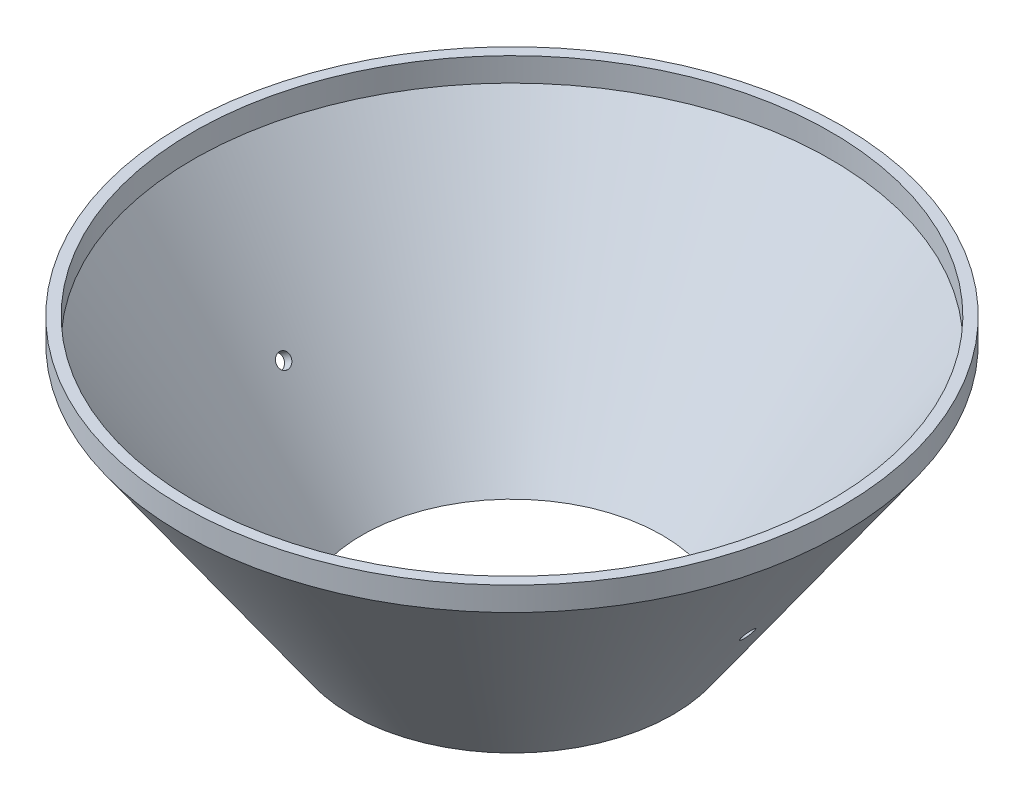
ISO-10303-21;
HEADER;
FILE_DESCRIPTION(('STEP AP214'),'2;1');
FILE_NAME('part.step','',(''),(''),'','','');
FILE_SCHEMA(('AUTOMOTIVE_DESIGN { 1 0 10303 214 1 1 1 1 }'));
ENDSEC;
DATA;
#1=APPLICATION_CONTEXT('core data for automotive mechanical design processes');
#2=APPLICATION_PROTOCOL_DEFINITION('international standard','automotive_design',2000,#1);
#3=PRODUCT_CONTEXT('',#1,'mechanical');
#4=PRODUCT('Part','Part','',(#3));
#5=PRODUCT_RELATED_PRODUCT_CATEGORY('part','',(#4));
#6=PRODUCT_DEFINITION_FORMATION('','',#4);
#7=PRODUCT_DEFINITION_CONTEXT('part definition',#1,'design');
#8=PRODUCT_DEFINITION('design','',#6,#7);
#9=PRODUCT_DEFINITION_SHAPE('','',#8);
#10=(LENGTH_UNIT() NAMED_UNIT(*) SI_UNIT(.MILLI.,.METRE.));
#11=(NAMED_UNIT(*) PLANE_ANGLE_UNIT() SI_UNIT($,.RADIAN.));
#12=(NAMED_UNIT(*) SI_UNIT($,.STERADIAN.) SOLID_ANGLE_UNIT());
#13=UNCERTAINTY_MEASURE_WITH_UNIT(LENGTH_MEASURE(1.E-05),#10,'distance_accuracy_value','');
#14=(GEOMETRIC_REPRESENTATION_CONTEXT(3) GLOBAL_UNCERTAINTY_ASSIGNED_CONTEXT((#13)) GLOBAL_UNIT_ASSIGNED_CONTEXT((#10,
#11,#12)) REPRESENTATION_CONTEXT('',''));
#15=CARTESIAN_POINT('',(0.,0.,0.));
#16=DIRECTION('',(0.,0.,1.));
#17=DIRECTION('',(1.,0.,0.));
#18=AXIS2_PLACEMENT_3D('',#15,#16,#17);
#19=CARTESIAN_POINT('',(0.,0.,0.));
#20=DIRECTION('',(0.,1.,0.));
#21=DIRECTION('',(0.,0.,1.));
#22=AXIS2_PLACEMENT_3D('',#19,#20,#21);
#23=CONICAL_SURFACE('',#22,12.63,0.610865238198013);
#24=CARTESIAN_POINT('',(18.9409920304637,9.0174198213227,-0.341221752310358));
#25=CARTESIAN_POINT('',(18.9516528807942,9.03335579514401,-0.368943909328451));
#26=CARTESIAN_POINT('',(18.9636435000784,9.05123552282013,-0.395067037450147));
#27=CARTESIAN_POINT('',(18.9899743840398,9.09035338379973,-0.443349914106763));
#28=CARTESIAN_POINT('',(19.0043174497796,9.1115955196641,-0.465504871129191));
#29=CARTESIAN_POINT('',(19.0349633828263,9.15679390072063,-0.50518849983412));
#30=CARTESIAN_POINT('',(19.0512653268974,9.18074886702915,-0.522719338550814));
#31=CARTESIAN_POINT('',(19.0853931640646,9.23067439551349,-0.552662840553579));
#32=CARTESIAN_POINT('',(19.1032186768391,9.25664445452257,-0.565076776669665));
#33=CARTESIAN_POINT('',(19.1399109995928,9.30985368090245,-0.584440567537122));
#34=CARTESIAN_POINT('',(19.1587777706456,9.33709280082461,-0.591390626402794));
#35=CARTESIAN_POINT('',(19.1970293725544,9.3920606076407,-0.599629592854147));
#36=CARTESIAN_POINT('',(19.2164142227705,9.41978931281672,-0.60091828858248));
#37=CARTESIAN_POINT('',(19.2551462793119,9.47493881765334,-0.597797819956837));
#38=CARTESIAN_POINT('',(19.2744934948745,9.50235970373208,-0.593390297285299));
#39=CARTESIAN_POINT('',(19.3125978896348,9.55612948038676,-0.579005599975749));
#40=CARTESIAN_POINT('',(19.3313550697851,9.58247837269348,-0.569028434330533));
#41=CARTESIAN_POINT('',(19.3677306271828,9.63337050382939,-0.543787270498571));
#42=CARTESIAN_POINT('',(19.3853489389023,9.65791363877063,-0.528522968422767));
#43=CARTESIAN_POINT('',(19.418921477716,9.70451373168668,-0.493141031359007));
#44=CARTESIAN_POINT('',(19.4348757045594,9.72657068928651,-0.473023395639034));
#45=CARTESIAN_POINT('',(19.4646436210162,9.76759906631191,-0.428498929059879));
#46=CARTESIAN_POINT('',(19.478456690162,9.78656959142532,-0.404090859268899));
#47=CARTESIAN_POINT('',(19.5035154908795,9.82089977862868,-0.351681822803491));
#48=CARTESIAN_POINT('',(19.5147612184523,9.83625943509415,-0.32368085053267));
#49=CARTESIAN_POINT('',(19.5343397661102,9.86295178733934,-0.264878076519693));
#50=CARTESIAN_POINT('',(19.542672364744,9.87428417697387,-0.234076062071062));
#51=CARTESIAN_POINT('',(19.5561648101363,9.89261354016701,-0.170547348437313));
#52=CARTESIAN_POINT('',(19.5613246634901,9.89961052273778,-0.137820653253258));
#53=CARTESIAN_POINT('',(19.5683097414493,9.90907886567705,-0.0713802071735972));
#54=CARTESIAN_POINT('',(19.5701357893078,9.9115513433315,-0.0376667020516754));
#55=CARTESIAN_POINT('',(19.5703986409376,9.91190736541768,0.0297977072534092));
#56=CARTESIAN_POINT('',(19.5688354486134,9.90979091513603,0.063548611393442));
#57=CARTESIAN_POINT('',(19.5623693554034,9.90102703926073,0.130123075161604));
#58=CARTESIAN_POINT('',(19.5574670852682,9.89438046940476,0.162946808712521));
#59=CARTESIAN_POINT('',(19.5444764066079,9.87673666923223,0.226742209433612));
#60=CARTESIAN_POINT('',(19.5363879948134,9.86573943445126,0.257713874703265));
#61=CARTESIAN_POINT('',(19.5172744794256,9.83968964124902,0.316931433895236));
#62=CARTESIAN_POINT('',(19.5062489125108,9.82463644301547,0.345176896814268));
#63=CARTESIAN_POINT('',(19.4816012673562,9.79088395687603,0.398135619957056));
#64=CARTESIAN_POINT('',(19.4679791843011,9.77218466220844,0.422848873630181));
#65=CARTESIAN_POINT('',(19.4385502170128,9.7316443887814,0.468048391004436));
#66=CARTESIAN_POINT('',(19.4227427576482,9.70980258293727,0.488533538434191));
#67=CARTESIAN_POINT('',(19.3894229293304,9.66358050446548,0.524687191991051));
#68=CARTESIAN_POINT('',(19.3719105610265,9.63920023280481,0.540355699952949));
#69=CARTESIAN_POINT('',(19.3357034543183,9.58857652416261,0.566430488966751));
#70=CARTESIAN_POINT('',(19.3170087596837,9.56233315614848,0.576836964690846));
#71=CARTESIAN_POINT('',(19.278985518405,9.50871473112502,0.592092607309417));
#72=CARTESIAN_POINT('',(19.2596569727668,9.48133967591143,0.596941783021796));
#73=CARTESIAN_POINT('',(19.2209301853392,9.4262367058419,0.600944259560997));
#74=CARTESIAN_POINT('',(19.2015319651402,9.39850889449173,0.600099194398645));
#75=CARTESIAN_POINT('',(19.1632107021641,9.34348033562615,0.592741075740981));
#76=CARTESIAN_POINT('',(19.1442876585822,9.31617958738738,0.586228031846973));
#77=CARTESIAN_POINT('',(19.1074451751407,9.26279002378877,0.567720083972554));
#78=CARTESIAN_POINT('',(19.0895256394528,9.23670109274913,0.555725704428884));
#79=CARTESIAN_POINT('',(19.0551769514751,9.186485962648,0.526595960401006));
#80=CARTESIAN_POINT('',(19.0387478044656,9.16235977054041,0.509460577703492));
#81=CARTESIAN_POINT('',(19.0078154886344,9.11676697764842,0.470530262506525));
#82=CARTESIAN_POINT('',(18.9933127988557,9.09530103846516,0.448734174554881));
#83=CARTESIAN_POINT('',(18.9666191084016,9.0556656316715,0.401103215934937));
#84=CARTESIAN_POINT('',(18.954428115545,9.03749617521055,0.375268331607078));
#85=CARTESIAN_POINT('',(18.932670497573,9.00498708154816,0.320286275363405));
#86=CARTESIAN_POINT('',(18.9231044593827,8.99064830088309,0.291138364730669));
#87=CARTESIAN_POINT('',(18.9068448344701,8.9662330439194,0.230363159170827));
#88=CARTESIAN_POINT('',(18.9001511322964,8.9561563963075,0.198735963957302));
#89=CARTESIAN_POINT('',(18.8898061164297,8.94056790092257,0.133908223698161));
#90=CARTESIAN_POINT('',(18.8861539701373,8.93505480391981,0.100708111856573));
#91=CARTESIAN_POINT('',(18.8819804712424,8.92875382241924,0.0336597777743027));
#92=CARTESIAN_POINT('',(18.8814598860175,8.92796709610127,-0.000188601283556134));
#93=CARTESIAN_POINT('',(18.8835636636255,8.93114416410418,-0.0675665199245233));
#94=CARTESIAN_POINT('',(18.8861886374448,8.93510888133485,-0.101095996289468));
#95=CARTESIAN_POINT('',(18.8945180001919,8.94767030676081,-0.166851548132624));
#96=CARTESIAN_POINT('',(18.9002187055197,8.95626147413967,-0.199079133274329));
#97=CARTESIAN_POINT('',(18.9118670403593,8.97377563061058,-0.249700905151459));
#98=CARTESIAN_POINT('',(18.9169294507424,8.98137959517991,-0.268771196420281));
#99=CARTESIAN_POINT('',(18.9281511365663,8.9982078066753,-0.305844279334318));
#100=CARTESIAN_POINT('',(18.9343104119751,9.00743205355399,-0.323847071010733));
#101=CARTESIAN_POINT('',(18.9409920304637,9.0174198213227,-0.341221752310358));
#102=B_SPLINE_CURVE_WITH_KNOTS('',3,(#24,#25,#26,#27,#28,#29,#30,#31,#32,#33,#34,#35,#36,#37,
#38,#39,#40,#41,#42,#43,#44,#45,#46,#47,#48,#49,#50,#51,#52,#53,#54,#55,#56,#57,#58,#59,#60,#61,
#62,#63,#64,#65,#66,#67,#68,#69,#70,#71,#72,#73,#74,#75,#76,#77,#78,#79,#80,#81,#82,#83,#84,#85,
#86,#87,#88,#89,#90,#91,#92,#93,#94,#95,#96,#97,#98,#99,#100,#101),.UNSPECIFIED.,.T.,.F.,(4,2,2,
2,2,2,2,2,2,2,2,2,2,2,2,2,2,2,2,2,2,2,2,2,2,2,2,2,2,2,2,2,2,2,2,2,2,2,4),(0.,0.10104235923319,
0.202205915079846,0.30332197734218,0.404412871772923,0.505499989567225,0.606590890172453,
0.707652662303131,0.808714271259004,0.909781689903226,1.01084912379122,1.11194579061356,
1.21304261490842,1.31414712274878,1.41525142041871,1.51633074791722,1.61740995896861,
1.71847008148962,1.81953030771289,1.9206064851317,2.0216828499981,2.12278586621353,
2.22388884391596,2.32498808097645,2.42608715762013,2.52715722426009,2.62822711969221,
2.72928734710247,2.83034793254846,2.93143360139531,3.03251961213003,3.13362820674223,
3.23473273698328,3.33580958163437,3.43691119378623,3.53803244687288,3.63903286168514,
3.70236050388859,3.76568814424115),.UNSPECIFIED.);
#103=CARTESIAN_POINT('',(18.9409920304637,9.0174198213227,-0.341221752310358));
#104=VERTEX_POINT('',#103);
#105=EDGE_CURVE('E58',#104,#104,#102,.T.);
#106=ORIENTED_EDGE('',*,*,#105,.T.);
#107=EDGE_LOOP('',(#106));
#108=FACE_BOUND('',#107,.T.);
#109=CARTESIAN_POINT('',(0.,20.2860127652251,0.));
#110=DIRECTION('',(0.,1.,0.));
#111=DIRECTION('',(0.,0.,1.));
#112=AXIS2_PLACEMENT_3D('',#109,#110,#111);
#113=CIRCLE('',#112,26.8344190584289);
#114=CARTESIAN_POINT('',(0.,20.2860127652251,26.8344190584289));
#115=VERTEX_POINT('',#114);
#116=EDGE_CURVE('E99',#115,#115,#113,.T.);
#117=ORIENTED_EDGE('',*,*,#116,.T.);
#118=EDGE_LOOP('',(#117));
#119=FACE_BOUND('',#118,.T.);
#120=CARTESIAN_POINT('',(0.,0.,0.));
#121=DIRECTION('',(0.,1.,0.));
#122=DIRECTION('',(0.,0.,1.));
#123=AXIS2_PLACEMENT_3D('',#120,#121,#122);
#124=CIRCLE('',#123,12.63);
#125=CARTESIAN_POINT('',(0.,0.,12.63));
#126=VERTEX_POINT('',#125);
#127=EDGE_CURVE('E10',#126,#126,#124,.T.);
#128=ORIENTED_EDGE('',*,*,#127,.F.);
#129=EDGE_LOOP('',(#128));
#130=FACE_BOUND('',#129,.T.);
#131=CARTESIAN_POINT('',(-19.4175885176778,9.70263879091386,-0.493584225455071));
#132=CARTESIAN_POINT('',(-19.401358281771,9.68016229249147,-0.512741554706572));
#133=CARTESIAN_POINT('',(-19.3842083219253,9.6563303550641,-0.529572307843522));
#134=CARTESIAN_POINT('',(-19.3485868387306,9.60662035558906,-0.55808031479809));
#135=CARTESIAN_POINT('',(-19.3301137610521,9.58073988315153,-0.569751387967736));
#136=CARTESIAN_POINT('',(-19.2924106182585,9.52768117822798,-0.587585099760743));
#137=CARTESIAN_POINT('',(-19.2731809071034,9.50050355132441,-0.593750282841554));
#138=CARTESIAN_POINT('',(-19.2345210675658,9.44561254210044,-0.600402352030291));
#139=CARTESIAN_POINT('',(-19.2150909900072,9.41789929415578,-0.600890644290871));
#140=CARTESIAN_POINT('',(-19.1765805091088,9.36271767045297,-0.59617963148716));
#141=CARTESIAN_POINT('',(-19.1575000758947,9.33524927387818,-0.590980814666785));
#142=CARTESIAN_POINT('',(-19.1202199661323,9.28133946924398,-0.575043678832523));
#143=CARTESIAN_POINT('',(-19.1020203243432,9.25489810172281,-0.564305141396736));
#144=CARTESIAN_POINT('',(-19.0670007646207,9.20380503618891,-0.53759319556737));
#145=CARTESIAN_POINT('',(-19.0501808948431,9.17915340064377,-0.521619604560236));
#146=CARTESIAN_POINT('',(-19.0183735379543,9.1323573899341,-0.484891136578407));
#147=CARTESIAN_POINT('',(-19.0033860509059,9.11021301485563,-0.464136259439591));
#148=CARTESIAN_POINT('',(-18.9756344886406,9.06907390168621,-0.418427061129777));
#149=CARTESIAN_POINT('',(-18.9628710739623,9.05008009938014,-0.393471496686934));
#150=CARTESIAN_POINT('',(-18.939904237595,9.01581068222031,-0.340073127500662));
#151=CARTESIAN_POINT('',(-18.9297008124928,9.00053506240915,-0.311630327406792));
#152=CARTESIAN_POINT('',(-18.9121143372266,8.97415475073056,-0.252062134454913));
#153=CARTESIAN_POINT('',(-18.9047314879638,8.963050355968,-0.220936550703683));
#154=CARTESIAN_POINT('',(-18.892974144582,8.94534574379358,-0.156888039060699));
#155=CARTESIAN_POINT('',(-18.8885996478745,8.93874552250618,-0.123965112715469));
#156=CARTESIAN_POINT('',(-18.8829697752905,8.93024833907432,-0.0572661068152133));
#157=CARTESIAN_POINT('',(-18.88171355048,8.92835009683969,-0.0234902619930983));
#158=CARTESIAN_POINT('',(-18.8823492238672,8.92931015662237,0.0439640183005133));
#159=CARTESIAN_POINT('',(-18.884241116928,8.93216845087811,0.0776424539308693));
#160=CARTESIAN_POINT('',(-18.8911249580144,8.94255477241331,0.143939432796073));
#161=CARTESIAN_POINT('',(-18.8961163315958,8.95008193438496,0.176558171251997));
#162=CARTESIAN_POINT('',(-18.9090730812844,8.96957984270635,0.239816878822741));
#163=CARTESIAN_POINT('',(-18.9170384619207,8.9815505958233,0.270456844923983));
#164=CARTESIAN_POINT('',(-18.9357432063248,9.00958157393836,0.328894924715397));
#165=CARTESIAN_POINT('',(-18.9464831155053,9.02564260298794,0.356692478147025));
#166=CARTESIAN_POINT('',(-18.970460820221,9.06137671622384,0.408650710275896));
#167=CARTESIAN_POINT('',(-18.9836986200892,9.08104980667594,0.432811382664182));
#168=CARTESIAN_POINT('',(-19.0123315442464,9.12343413798412,0.476816578324764));
#169=CARTESIAN_POINT('',(-19.0277272398111,9.14614618329266,0.496659955085492));
#170=CARTESIAN_POINT('',(-19.0602655580122,9.19393973603781,0.531459066221769));
#171=CARTESIAN_POINT('',(-19.0774081796317,9.2190212420951,0.546414803442521));
#172=CARTESIAN_POINT('',(-19.1129760667955,9.27082307710547,0.571012621441633));
#173=CARTESIAN_POINT('',(-19.1314012238735,9.29754326744928,0.58065515095438));
#174=CARTESIAN_POINT('',(-19.1690280768323,9.35185460362496,0.594354225016951));
#175=CARTESIAN_POINT('',(-19.1882297710721,9.37944574761611,0.598410781371617));
#176=CARTESIAN_POINT('',(-19.2268647405924,9.43470279154599,0.600822152710128));
#177=CARTESIAN_POINT('',(-19.2462979461925,9.46236866714561,0.599178642151332));
#178=CARTESIAN_POINT('',(-19.2848457570536,9.517000608428,0.590240368933642));
#179=CARTESIAN_POINT('',(-19.3039603622603,9.54396667399158,0.582945605312338));
#180=CARTESIAN_POINT('',(-19.3413141486674,9.59644210410574,0.562912646850215));
#181=CARTESIAN_POINT('',(-19.3595533642712,9.62195152591124,0.550174666127984));
#182=CARTESIAN_POINT('',(-19.3946183905132,9.67080636420266,0.519617112582942));
#183=CARTESIAN_POINT('',(-19.4114442000467,9.69415177899725,0.501797535788531));
#184=CARTESIAN_POINT('',(-19.4431827994753,9.73804158398756,0.461576916617102));
#185=CARTESIAN_POINT('',(-19.4580950704815,9.75858521452563,0.439174635815026));
#186=CARTESIAN_POINT('',(-19.4855489809308,9.79630193869703,0.390427016085142));
#187=CARTESIAN_POINT('',(-19.4980906135772,9.8134750226669,0.364081665852815));
#188=CARTESIAN_POINT('',(-19.5204205628929,9.84398577067069,0.30819065627958));
#189=CARTESIAN_POINT('',(-19.5302084420283,9.85732282521921,0.278644489404205));
#190=CARTESIAN_POINT('',(-19.5467254797967,9.87979628462473,0.21719369303398));
#191=CARTESIAN_POINT('',(-19.5534546363181,9.88893268658159,0.185289061910858));
#192=CARTESIAN_POINT('',(-19.5636438208904,9.90275656631891,0.120032900465696));
#193=CARTESIAN_POINT('',(-19.5671044128359,9.90744481149837,0.0866816207590281));
#194=CARTESIAN_POINT('',(-19.5706501951097,9.91224837987877,0.0194754291027008));
#195=CARTESIAN_POINT('',(-19.5707355226306,9.9123638889451,-0.0143794623209834));
#196=CARTESIAN_POINT('',(-19.5675291615335,9.90802030192253,-0.0816206311640748));
#197=CARTESIAN_POINT('',(-19.5642386524977,9.90356280373027,-0.115007068139814));
#198=CARTESIAN_POINT('',(-19.5543834728714,9.89019352288147,-0.180384920454299));
#199=CARTESIAN_POINT('',(-19.5478179925184,9.88128063859445,-0.212375988648692));
#200=CARTESIAN_POINT('',(-19.531614290467,9.8592374837752,-0.274060674640525));
#201=CARTESIAN_POINT('',(-19.5219743808316,9.84610489649272,-0.303753019227272));
#202=CARTESIAN_POINT('',(-19.499927230821,9.81598787016023,-0.359954749885985));
#203=CARTESIAN_POINT('',(-19.4875233058232,9.79900804538287,-0.386467891226355));
#204=CARTESIAN_POINT('',(-19.4654082770515,9.76863542846856,-0.426421010043449));
#205=CARTESIAN_POINT('',(-19.4564143963297,9.75626138418274,-0.441052716403137));
#206=CARTESIAN_POINT('',(-19.4375972560163,9.73031576317857,-0.468623118992379));
#207=CARTESIAN_POINT('',(-19.4277739961247,9.716744186027,-0.481561814609453));
#208=CARTESIAN_POINT('',(-19.4175885176778,9.70263879091386,-0.493584225455071));
#209=B_SPLINE_CURVE_WITH_KNOTS('',3,(#131,#132,#133,#134,#135,#136,#137,#138,#139,#140,#141,
#142,#143,#144,#145,#146,#147,#148,#149,#150,#151,#152,#153,#154,#155,#156,#157,#158,#159,#160,
#161,#162,#163,#164,#165,#166,#167,#168,#169,#170,#171,#172,#173,#174,#175,#176,#177,#178,#179,
#180,#181,#182,#183,#184,#185,#186,#187,#188,#189,#190,#191,#192,#193,#194,#195,#196,#197,#198,
#199,#200,#201,#202,#203,#204,#205,#206,#207,#208),.UNSPECIFIED.,.T.,.F.,(4,2,2,2,2,2,2,2,2,2,2,
2,2,2,2,2,2,2,2,2,2,2,2,2,2,2,2,2,2,2,2,2,2,2,2,2,2,2,4),(0.,0.10101959623833,0.202159875524665,
0.303253390254795,0.404321863822778,0.505381661243674,0.606445443587611,0.707512751698957,
0.808580063279501,0.909677340383717,1.01077448269558,1.11187882451312,1.21298307933683,
1.31405980600863,1.41513636774675,1.5161942019858,1.61725219012765,1.7183300592329,
1.81940810367752,1.92051295797901,2.02161775342502,2.12271400861483,2.2238100501575,
2.32487639614162,2.42594275933736,2.52700514727461,2.62806761419895,2.72915742830185,
2.83024753222815,2.9313536889381,3.0324599154519,3.13354869587807,3.23463336740189,
3.3356827300244,3.43675709029216,3.53788703867084,3.63889633062107,3.70229236219332,
3.76568841670026),.UNSPECIFIED.);
#210=CARTESIAN_POINT('',(-19.4175885176778,9.70263879091386,-0.493584225455071));
#211=VERTEX_POINT('',#210);
#212=EDGE_CURVE('E59',#211,#211,#209,.T.);
#213=ORIENTED_EDGE('',*,*,#212,.T.);
#214=EDGE_LOOP('',(#213));
#215=FACE_BOUND('',#214,.T.);
#216=ADVANCED_FACE('F33',(#108,#119,#130,#215),#23,.F.);
#217=CARTESIAN_POINT('',(0.,0.,0.));
#218=DIRECTION('',(0.,1.,0.));
#219=DIRECTION('',(0.,0.,1.));
#220=AXIS2_PLACEMENT_3D('',#217,#218,#219);
#221=CONICAL_SURFACE('',#220,13.5455809415711,0.610865238198013);
#222=CARTESIAN_POINT('',(19.5493810364446,8.57817216272589,-0.324964622568822));
#223=CARTESIAN_POINT('',(19.5595370424983,8.59334700084194,-0.353296683716635));
#224=CARTESIAN_POINT('',(19.5710490332541,8.61050933525755,-0.380107239314218));
#225=CARTESIAN_POINT('',(19.5964876814979,8.64830179497367,-0.42990045901179));
#226=CARTESIAN_POINT('',(19.6104172203701,8.66893605742836,-0.452878490445389));
#227=CARTESIAN_POINT('',(19.6403127454773,8.71304662796792,-0.494319609667414));
#228=CARTESIAN_POINT('',(19.6562777685507,8.73652159160863,-0.512784820880278));
#229=CARTESIAN_POINT('',(19.6898179959309,8.78562848824762,-0.544682028627718));
#230=CARTESIAN_POINT('',(19.707392798613,8.81125988310759,-0.558115276355362));
#231=CARTESIAN_POINT('',(19.74367836113,8.86394287005416,-0.579574288853777));
#232=CARTESIAN_POINT('',(19.7623891129633,8.89099445213697,-0.587600091709051));
#233=CARTESIAN_POINT('',(19.8004287627607,8.94574188579901,-0.598016004667212));
#234=CARTESIAN_POINT('',(19.8197576838398,8.97343776145964,-0.60040590377718));
#235=CARTESIAN_POINT('',(19.8584815554792,9.02867602199109,-0.599481605889067));
#236=CARTESIAN_POINT('',(19.8778764857138,9.05621844824494,-0.596169029715915));
#237=CARTESIAN_POINT('',(19.9161805593865,9.11038051691155,-0.583937123750619));
#238=CARTESIAN_POINT('',(19.9350897037348,9.13700016105354,-0.575017804465641));
#239=CARTESIAN_POINT('',(19.971870427259,9.18857273950986,-0.551825725576345));
#240=CARTESIAN_POINT('',(19.9897419873914,9.21352564323471,-0.537552867750947));
#241=CARTESIAN_POINT('',(20.023917666357,9.26107235903146,-0.504059023206526));
#242=CARTESIAN_POINT('',(20.0402217851719,9.28366617107583,-0.484838036429759));
#243=CARTESIAN_POINT('',(20.0707773677205,9.3258788331042,-0.441987417137616));
#244=CARTESIAN_POINT('',(20.0850282794254,9.34549688309404,-0.418356602893182));
#245=CARTESIAN_POINT('',(20.111039410484,9.38121426960515,-0.367360033828052));
#246=CARTESIAN_POINT('',(20.1227996254785,9.39731359996786,-0.339994272470496));
#247=CARTESIAN_POINT('',(20.1434697285385,9.42555690342294,-0.282301041724159));
#248=CARTESIAN_POINT('',(20.1523793187764,9.43770046322668,-0.251973263301512));
#249=CARTESIAN_POINT('',(20.1670709694438,9.45770049723448,-0.189219200047506));
#250=CARTESIAN_POINT('',(20.1728530356757,9.46555697939216,-0.156792919109528));
#251=CARTESIAN_POINT('',(20.1811089444156,9.47676902674286,-0.0907697002319487));
#252=CARTESIAN_POINT('',(20.1835834939534,9.48012555386715,-0.0571730140595466));
#253=CARTESIAN_POINT('',(20.1851494803139,9.48225009167002,0.010243523795957));
#254=CARTESIAN_POINT('',(20.1842409213163,9.48101810801762,0.0440633752032913));
#255=CARTESIAN_POINT('',(20.17906958435,9.47399964404117,0.110959038690635));
#256=CARTESIAN_POINT('',(20.1748074815482,9.46821408048656,0.14403499915918));
#257=CARTESIAN_POINT('',(20.1630625900963,9.45224597464533,0.208511277531829));
#258=CARTESIAN_POINT('',(20.1555797989881,9.44206342900273,0.239911594156981));
#259=CARTESIAN_POINT('',(20.1376243363166,9.41757555499025,0.300149490312944));
#260=CARTESIAN_POINT('',(20.1271513086268,9.40326973555114,0.328986764057694));
#261=CARTESIAN_POINT('',(20.1035380762908,9.37092422368827,0.383276639524541));
#262=CARTESIAN_POINT('',(20.0903978668139,9.3528845245018,0.408729235116246));
#263=CARTESIAN_POINT('',(20.0618474265081,9.31355807373745,0.455534080369638));
#264=CARTESIAN_POINT('',(20.0464366115863,9.29227048661916,0.476885271716166));
#265=CARTESIAN_POINT('',(20.0138128606126,9.24703581952251,0.514873214328118));
#266=CARTESIAN_POINT('',(19.9965999247952,9.22308873988991,0.531509966206499));
#267=CARTESIAN_POINT('',(19.9608854313788,9.17319699726287,0.559596533340019));
#268=CARTESIAN_POINT('',(19.9423838744836,9.14725233535928,0.571046351427685));
#269=CARTESIAN_POINT('',(19.9046365456067,9.09408856330952,0.588433523651939));
#270=CARTESIAN_POINT('',(19.8853907746844,9.06686945497739,0.594370885634705));
#271=CARTESIAN_POINT('',(19.846717755984,9.01192945316451,0.600563407202891));
#272=CARTESIAN_POINT('',(19.8272905573505,8.98420869376485,0.600820063315341));
#273=CARTESIAN_POINT('',(19.7888028077039,8.92904455513546,0.595647679628337));
#274=CARTESIAN_POINT('',(19.7697422560017,8.90160117538439,0.590218650517333));
#275=CARTESIAN_POINT('',(19.7325228384696,8.84778004856406,0.573830321856834));
#276=CARTESIAN_POINT('',(19.7143638628051,8.82140217176303,0.562871697776199));
#277=CARTESIAN_POINT('',(19.6794428433793,8.77046889605847,0.535735858948452));
#278=CARTESIAN_POINT('',(19.6626808042195,8.74591350315819,0.519558627012242));
#279=CARTESIAN_POINT('',(19.6310011367027,8.69933371578632,0.482440800296324));
#280=CARTESIAN_POINT('',(19.6160839003487,8.67730985931192,0.461499195808296));
#281=CARTESIAN_POINT('',(19.5884920850044,8.63644387859619,0.415448613222085));
#282=CARTESIAN_POINT('',(19.5758175137939,8.61760176539244,0.390339620667709));
#283=CARTESIAN_POINT('',(19.5530379256468,8.58365073252181,0.336660025828245));
#284=CARTESIAN_POINT('',(19.5429335135721,8.56854269165619,0.308088611027242));
#285=CARTESIAN_POINT('',(19.5255578912076,8.54251444912642,0.248300670681893));
#286=CARTESIAN_POINT('',(19.5182865678356,8.5315940803124,0.217084250772991));
#287=CARTESIAN_POINT('',(19.5067625926735,8.51426794045059,0.152899150927368));
#288=CARTESIAN_POINT('',(19.5025092422048,8.50786112449105,0.119930878455817));
#289=CARTESIAN_POINT('',(19.4971254532701,8.49974916502296,0.0531620834441851));
#290=CARTESIAN_POINT('',(19.4959957807174,8.49804517462861,0.0193613588395418));
#291=CARTESIAN_POINT('',(19.4968889972643,8.49939178663212,-0.048107013313403));
#292=CARTESIAN_POINT('',(19.4989125172402,8.50244334049772,-0.0817746328794348));
#293=CARTESIAN_POINT('',(19.5060620820853,8.51321099049233,-0.147988033676756));
#294=CARTESIAN_POINT('',(19.5111844139714,8.52092150426266,-0.180535108289936));
#295=CARTESIAN_POINT('',(19.5219209296844,8.53704921063518,-0.231809839495018));
#296=CARTESIAN_POINT('',(19.5266381615548,8.54412881865363,-0.251161892353974));
#297=CARTESIAN_POINT('',(19.5371864927279,8.55993624875091,-0.288863279953656));
#298=CARTESIAN_POINT('',(19.5430175919455,8.56866407070386,-0.307212614770964));
#299=CARTESIAN_POINT('',(19.5493810364446,8.57817216272589,-0.324964622568822));
#300=B_SPLINE_CURVE_WITH_KNOTS('',3,(#222,#223,#224,#225,#226,#227,#228,#229,#230,#231,#232,
#233,#234,#235,#236,#237,#238,#239,#240,#241,#242,#243,#244,#245,#246,#247,#248,#249,#250,#251,
#252,#253,#254,#255,#256,#257,#258,#259,#260,#261,#262,#263,#264,#265,#266,#267,#268,#269,#270,
#271,#272,#273,#274,#275,#276,#277,#278,#279,#280,#281,#282,#283,#284,#285,#286,#287,#288,#289,
#290,#291,#292,#293,#294,#295,#296,#297,#298,#299),.UNSPECIFIED.,.T.,.F.,(4,2,2,2,2,2,2,2,2,2,2,
2,2,2,2,2,2,2,2,2,2,2,2,2,2,2,2,2,2,2,2,2,2,2,2,2,2,2,4),(0.,0.101042326019583,
0.202205918131001,0.30332181753438,0.404412557847252,0.505502586173061,0.606596398974742,
0.70766148244211,0.808726376511746,0.909793124904211,1.01085987447609,1.11195374653059,
1.21304779552065,1.31415240316912,1.41525682324218,1.51633962731716,1.61742230650659,
1.71848463998669,1.81954705060248,1.92062150241736,2.02169613729767,2.1227968182692,
2.22389748609597,2.32499809871273,2.42609856742729,2.5271724018839,2.62824604633339,
2.72930734709809,2.83036898074281,2.93145205225449,3.03253547441914,3.13364266361971,
3.2347458167324,3.33582555622363,3.43693007786562,3.5380548306391,3.63905865549978,
3.70236870862474,3.7656787569144),.UNSPECIFIED.);
#301=CARTESIAN_POINT('',(19.5493810364446,8.57817216272589,-0.324964622568822));
#302=VERTEX_POINT('',#301);
#303=EDGE_CURVE('E53',#302,#302,#300,.T.);
#304=ORIENTED_EDGE('',*,*,#303,.F.);
#305=EDGE_LOOP('',(#304));
#306=FACE_BOUND('',#305,.T.);
#307=CARTESIAN_POINT('',(0.,20.2860127652251,0.));
#308=DIRECTION('',(0.,1.,0.));
#309=DIRECTION('',(0.,0.,1.));
#310=AXIS2_PLACEMENT_3D('',#307,#308,#309);
#311=CIRCLE('',#310,27.75);
#312=CARTESIAN_POINT('',(0.,20.2860127652251,27.75));
#313=VERTEX_POINT('',#312);
#314=EDGE_CURVE('E50',#313,#313,#311,.T.);
#315=ORIENTED_EDGE('',*,*,#314,.F.);
#316=EDGE_LOOP('',(#315));
#317=FACE_BOUND('',#316,.T.);
#318=CARTESIAN_POINT('',(0.,0.,0.));
#319=DIRECTION('',(0.,1.,0.));
#320=DIRECTION('',(0.,0.,1.));
#321=AXIS2_PLACEMENT_3D('',#318,#319,#320);
#322=CIRCLE('',#321,13.5455809415711);
#323=CARTESIAN_POINT('',(0.,0.,13.5455809415711));
#324=VERTEX_POINT('',#323);
#325=EDGE_CURVE('E45',#324,#324,#322,.T.);
#326=ORIENTED_EDGE('',*,*,#325,.T.);
#327=EDGE_LOOP('',(#326));
#328=FACE_BOUND('',#327,.T.);
#329=CARTESIAN_POINT('',(-19.5493810364446,8.57817216272589,-0.324964622568823));
#330=CARTESIAN_POINT('',(-19.5392289750882,8.56300327013273,-0.296638133689282));
#331=CARTESIAN_POINT('',(-19.5304175460279,8.54979901356991,-0.266750081146618));
#332=CARTESIAN_POINT('',(-19.5157132880433,8.52773083410473,-0.204708215629071));
#333=CARTESIAN_POINT('',(-19.509823958691,8.51887211565968,-0.172551738302176));
#334=CARTESIAN_POINT('',(-19.5011252483899,8.50577804231957,-0.106920953745189));
#335=CARTESIAN_POINT('',(-19.4983144416415,8.50154054713641,-0.0734472640220809));
#336=CARTESIAN_POINT('',(-19.4958405515892,8.49781130211177,-0.00613045471087145));
#337=CARTESIAN_POINT('',(-19.4961766894715,8.49831837807185,0.0277125714021368));
#338=CARTESIAN_POINT('',(-19.4999858373758,8.504059465962,0.0948141337864579));
#339=CARTESIAN_POINT('',(-19.5034586484157,8.50929317804694,0.128072706997462));
#340=CARTESIAN_POINT('',(-19.5134536531549,8.52433091477029,0.193064726459603));
#341=CARTESIAN_POINT('',(-19.5199759681484,8.53413512120058,0.224798111990856));
#342=CARTESIAN_POINT('',(-19.5359053697084,8.55802234845051,0.285840798332837));
#343=CARTESIAN_POINT('',(-19.5453126986324,8.57210572874419,0.315149895226783));
#344=CARTESIAN_POINT('',(-19.5667713151297,8.60413279976471,0.370509894961095));
#345=CARTESIAN_POINT('',(-19.5788226024184,8.62207649007581,0.396560798152345));
#346=CARTESIAN_POINT('',(-19.6052607690185,8.66130008774745,0.444672673450028));
#347=CARTESIAN_POINT('',(-19.6196483056721,8.68258093401359,0.466732518902926));
#348=CARTESIAN_POINT('',(-19.650377888939,8.72785081780144,0.506227202192197));
#349=CARTESIAN_POINT('',(-19.6667199321482,8.75183985060631,0.523662048083765));
#350=CARTESIAN_POINT('',(-19.7009210507396,8.80182774936023,0.553411884923869));
#351=CARTESIAN_POINT('',(-19.7187801481513,8.82782664449435,0.565726801509713));
#352=CARTESIAN_POINT('',(-19.7555275729667,8.88108231367234,0.584886306462812));
#353=CARTESIAN_POINT('',(-19.7744158995674,8.90833908673482,0.591730899097934));
#354=CARTESIAN_POINT('',(-19.8126908966904,8.9633213972113,0.599753956874359));
#355=CARTESIAN_POINT('',(-19.832077432169,8.99104680691434,0.600933941503571));
#356=CARTESIAN_POINT('',(-19.870804243016,9.04618551887128,0.597598358453872));
#357=CARTESIAN_POINT('',(-19.8901445184405,9.07359882150368,0.593082797682879));
#358=CARTESIAN_POINT('',(-19.9282186638058,9.12733774843893,0.578485503553213));
#359=CARTESIAN_POINT('',(-19.9469526091331,9.15366350807214,0.568404465000821));
#360=CARTESIAN_POINT('',(-19.9832679023952,9.20449623436289,0.542963141349324));
#361=CARTESIAN_POINT('',(-20.0008492485377,9.22900319819227,0.527602848041374));
#362=CARTESIAN_POINT('',(-20.034340490786,9.27552495313528,0.492035290362168));
#363=CARTESIAN_POINT('',(-20.0502500361597,9.29753922137366,0.471827011825356));
#364=CARTESIAN_POINT('',(-20.0799146146794,9.33846477069804,0.427138533770416));
#365=CARTESIAN_POINT('',(-20.0936696448036,9.35737604743179,0.402658328260562));
#366=CARTESIAN_POINT('',(-20.1186092705722,9.39158285909963,0.350114546825227));
#367=CARTESIAN_POINT('',(-20.1297933104459,9.40687761227051,0.322050198151538));
#368=CARTESIAN_POINT('',(-20.1492433981536,9.43343015454405,0.263138551988209));
#369=CARTESIAN_POINT('',(-20.1575094479716,9.44468794639148,0.232291256390741));
#370=CARTESIAN_POINT('',(-20.1708668905883,9.4628604157671,0.168692677664963));
#371=CARTESIAN_POINT('',(-20.1759586204151,9.46977555436987,0.135941597071669));
#372=CARTESIAN_POINT('',(-20.182810321009,9.47907750413899,0.0694624508910509));
#373=CARTESIAN_POINT('',(-20.1845702980871,9.48146432388294,0.0357343871544636));
#374=CARTESIAN_POINT('',(-20.1847035663604,9.48164511888188,-0.0317319179016492));
#375=CARTESIAN_POINT('',(-20.1830777391598,9.47944028972203,-0.0654701542852819));
#376=CARTESIAN_POINT('',(-20.176491906699,9.47049978105285,-0.13200780267629));
#377=CARTESIAN_POINT('',(-20.1715319004482,9.46376410019754,-0.164807214404769));
#378=CARTESIAN_POINT('',(-20.1584321296656,9.44594415137334,-0.2285358772696));
#379=CARTESIAN_POINT('',(-20.1502924122706,9.43485994786796,-0.259465156121394));
#380=CARTESIAN_POINT('',(-20.1310851459512,9.40864318973967,-0.318576839505174));
#381=CARTESIAN_POINT('',(-20.1200175950419,9.39351063237222,-0.346759242174927));
#382=CARTESIAN_POINT('',(-20.0952915246592,9.35960400008651,-0.399584850655509));
#383=CARTESIAN_POINT('',(-20.0816323511822,9.34082900596164,-0.424227160349348));
#384=CARTESIAN_POINT('',(-20.0521407564522,9.30015259611188,-0.469265185720467));
#385=CARTESIAN_POINT('',(-20.0363083292943,9.27825117189215,-0.489660889858932));
#386=CARTESIAN_POINT('',(-20.0029448909485,9.23192060517617,-0.525629238799455));
#387=CARTESIAN_POINT('',(-19.9854136562721,9.20749113007064,-0.541201247881108));
#388=CARTESIAN_POINT('',(-19.9491759252723,9.15678327404249,-0.567076155539675));
#389=CARTESIAN_POINT('',(-19.9304694282028,9.13050489194645,-0.57737905077248));
#390=CARTESIAN_POINT('',(-19.8924333330176,9.07683787577816,-0.592421399536219));
#391=CARTESIAN_POINT('',(-19.8731038459288,9.04944943931394,-0.597161838815217));
#392=CARTESIAN_POINT('',(-19.8343773338462,8.99433045066236,-0.600947563030611));
#393=CARTESIAN_POINT('',(-19.8149803116244,8.96659991240056,-0.599993079025857));
#394=CARTESIAN_POINT('',(-19.7766747142194,8.9115929893994,-0.592418159302346));
#395=CARTESIAN_POINT('',(-19.7577659790112,8.88431645693894,-0.585799604767833));
#396=CARTESIAN_POINT('',(-19.7209514308426,8.83098207304359,-0.567083945346808));
#397=CARTESIAN_POINT('',(-19.7030458674231,8.80492452509705,-0.554985484062742));
#398=CARTESIAN_POINT('',(-19.6687234292682,8.75477597361117,-0.525648373516461));
#399=CARTESIAN_POINT('',(-19.6523074095046,8.73068610026428,-0.508406796233643));
#400=CARTESIAN_POINT('',(-19.6214286756772,8.68521013479919,-0.469286592485744));
#401=CARTESIAN_POINT('',(-19.6069636535136,8.66382084973824,-0.44741352541909));
#402=CARTESIAN_POINT('',(-19.5853193808581,8.63171811316281,-0.408574782773902));
#403=CARTESIAN_POINT('',(-19.5774332745259,8.61999578333092,-0.392816069498851));
#404=CARTESIAN_POINT('',(-19.5626491779902,8.59798184858166,-0.359898053334266));
#405=CARTESIAN_POINT('',(-19.5557511881519,8.58769024419307,-0.342738749927094));
#406=CARTESIAN_POINT('',(-19.5493810364446,8.57817216272589,-0.324964622568823));
#407=B_SPLINE_CURVE_WITH_KNOTS('',3,(#329,#330,#331,#332,#333,#334,#335,#336,#337,#338,#339,
#340,#341,#342,#343,#344,#345,#346,#347,#348,#349,#350,#351,#352,#353,#354,#355,#356,#357,#358,
#359,#360,#361,#362,#363,#364,#365,#366,#367,#368,#369,#370,#371,#372,#373,#374,#375,#376,#377,
#378,#379,#380,#381,#382,#383,#384,#385,#386,#387,#388,#389,#390,#391,#392,#393,#394,#395,#396,
#397,#398,#399,#400,#401,#402,#403,#404,#405,#406),.UNSPECIFIED.,.T.,.F.,(4,2,2,2,2,2,2,2,2,2,2,
2,2,2,2,2,2,2,2,2,2,2,2,2,2,2,2,2,2,2,2,2,2,2,2,2,2,2,4),(0.,0.101016617729165,
0.202153924959514,0.303244371215135,0.40430980001342,0.505368817941863,0.606431855846243,
0.707503385947615,0.808574905164265,0.909674911943596,1.01077474263949,1.11187604167458,
1.21297726183183,1.31405136084167,1.41512533726257,1.51618669824216,1.61724821636531,
1.7183308943347,1.81941371408193,1.92051836438953,2.02162294595486,2.12271679107987,
2.22381044471155,2.32487777861295,2.42594514253811,2.52701100827373,2.6280769425261,
2.72916841506756,2.83026016228971,2.93136522684858,3.03247035557497,3.13355756429534,
3.23464067165487,3.3356902197248,3.43676479346238,3.53789702001243,3.63890853399599,
3.70229378350108,3.76567905643256),.UNSPECIFIED.);
#408=CARTESIAN_POINT('',(-19.5493810364446,8.57817216272589,-0.324964622568823));
#409=VERTEX_POINT('',#408);
#410=EDGE_CURVE('E37',#409,#409,#407,.T.);
#411=ORIENTED_EDGE('',*,*,#410,.F.);
#412=EDGE_LOOP('',(#411));
#413=FACE_BOUND('',#412,.T.);
#414=ADVANCED_FACE('F60',(#306,#317,#328,#413),#221,.T.);
#415=CARTESIAN_POINT('',(0.,0.,0.));
#416=DIRECTION('',(0.,1.,0.));
#417=DIRECTION('',(0.,0.,1.));
#418=AXIS2_PLACEMENT_3D('',#415,#416,#417);
#419=PLANE('',#418);
#420=ORIENTED_EDGE('',*,*,#325,.F.);
#421=EDGE_LOOP('',(#420));
#422=FACE_BOUND('',#421,.T.);
#423=ORIENTED_EDGE('',*,*,#127,.T.);
#424=EDGE_LOOP('',(#423));
#425=FACE_BOUND('',#424,.T.);
#426=ADVANCED_FACE('F66',(#422,#425),#419,.F.);
#427=CARTESIAN_POINT('',(17.5878249294663,10.5674013820359,0.));
#428=DIRECTION('',(0.819152044288993,-0.573576436351044,0.));
#429=DIRECTION('',(0.573576436351044,0.819152044288993,0.));
#430=AXIS2_PLACEMENT_3D('',#427,#428,#429);
#431=CYLINDRICAL_SURFACE('',#430,0.6);
#432=ORIENTED_EDGE('',*,*,#105,.F.);
#433=EDGE_LOOP('',(#432));
#434=FACE_BOUND('',#433,.T.);
#435=ORIENTED_EDGE('',*,*,#303,.T.);
#436=EDGE_LOOP('',(#435));
#437=FACE_BOUND('',#436,.T.);
#438=ADVANCED_FACE('F62',(#434,#437),#431,.F.);
#439=CARTESIAN_POINT('',(-17.5878249294663,10.5674013820359,0.));
#440=DIRECTION('',(-0.819152044288993,-0.573576436351044,0.));
#441=DIRECTION('',(0.573576436351044,-0.819152044288993,0.));
#442=AXIS2_PLACEMENT_3D('',#439,#440,#441);
#443=CYLINDRICAL_SURFACE('',#442,0.6);
#444=ORIENTED_EDGE('',*,*,#212,.F.);
#445=EDGE_LOOP('',(#444));
#446=FACE_BOUND('',#445,.T.);
#447=ORIENTED_EDGE('',*,*,#410,.T.);
#448=EDGE_LOOP('',(#447));
#449=FACE_BOUND('',#448,.T.);
#450=ADVANCED_FACE('F65',(#446,#449),#443,.F.);
#451=CARTESIAN_POINT('',(0.,22.2860127652251,0.));
#452=DIRECTION('',(0.,1.,0.));
#453=DIRECTION('',(0.,0.,1.));
#454=AXIS2_PLACEMENT_3D('',#451,#452,#453);
#455=PLANE('',#454);
#456=CARTESIAN_POINT('',(0.,22.2860127652251,0.));
#457=DIRECTION('',(0.,1.,0.));
#458=DIRECTION('',(0.,0.,1.));
#459=AXIS2_PLACEMENT_3D('',#456,#457,#458);
#460=CIRCLE('',#459,27.75);
#461=CARTESIAN_POINT('',(0.,22.2860127652251,27.75));
#462=VERTEX_POINT('',#461);
#463=EDGE_CURVE('E92',#462,#462,#460,.T.);
#464=ORIENTED_EDGE('',*,*,#463,.T.);
#465=EDGE_LOOP('',(#464));
#466=FACE_BOUND('',#465,.T.);
#467=CARTESIAN_POINT('',(0.,22.2860127652251,0.));
#468=DIRECTION('',(0.,1.,0.));
#469=DIRECTION('',(0.,0.,1.));
#470=AXIS2_PLACEMENT_3D('',#467,#468,#469);
#471=CIRCLE('',#470,26.8344190584289);
#472=CARTESIAN_POINT('',(0.,22.2860127652251,26.8344190584289));
#473=VERTEX_POINT('',#472);
#474=EDGE_CURVE('E95',#473,#473,#471,.T.);
#475=ORIENTED_EDGE('',*,*,#474,.F.);
#476=EDGE_LOOP('',(#475));
#477=FACE_BOUND('',#476,.T.);
#478=ADVANCED_FACE('F114',(#466,#477),#455,.T.);
#479=CARTESIAN_POINT('',(0.,22.2860127652251,0.));
#480=DIRECTION('',(0.,-1.,0.));
#481=DIRECTION('',(0.,0.,-1.));
#482=AXIS2_PLACEMENT_3D('',#479,#480,#481);
#483=CYLINDRICAL_SURFACE('',#482,27.75);
#484=ORIENTED_EDGE('',*,*,#463,.F.);
#485=EDGE_LOOP('',(#484));
#486=FACE_BOUND('',#485,.T.);
#487=ORIENTED_EDGE('',*,*,#314,.T.);
#488=EDGE_LOOP('',(#487));
#489=FACE_BOUND('',#488,.T.);
#490=ADVANCED_FACE('F82',(#486,#489),#483,.T.);
#491=CARTESIAN_POINT('',(0.,22.2860127652251,0.));
#492=DIRECTION('',(0.,-1.,0.));
#493=DIRECTION('',(0.,0.,-1.));
#494=AXIS2_PLACEMENT_3D('',#491,#492,#493);
#495=CYLINDRICAL_SURFACE('',#494,26.8344190584289);
#496=ORIENTED_EDGE('',*,*,#474,.T.);
#497=EDGE_LOOP('',(#496));
#498=FACE_BOUND('',#497,.T.);
#499=ORIENTED_EDGE('',*,*,#116,.F.);
#500=EDGE_LOOP('',(#499));
#501=FACE_BOUND('',#500,.T.);
#502=ADVANCED_FACE('F107',(#498,#501),#495,.F.);
#503=CLOSED_SHELL('',(#216,#414,#426,#438,#450,#478,#490,#502));
#504=MANIFOLD_SOLID_BREP('B2',#503);
#505=ADVANCED_BREP_SHAPE_REPRESENTATION('',(#18,#504),#14);
#506=SHAPE_DEFINITION_REPRESENTATION(#9,#505);
ENDSEC;
END-ISO-10303-21;
